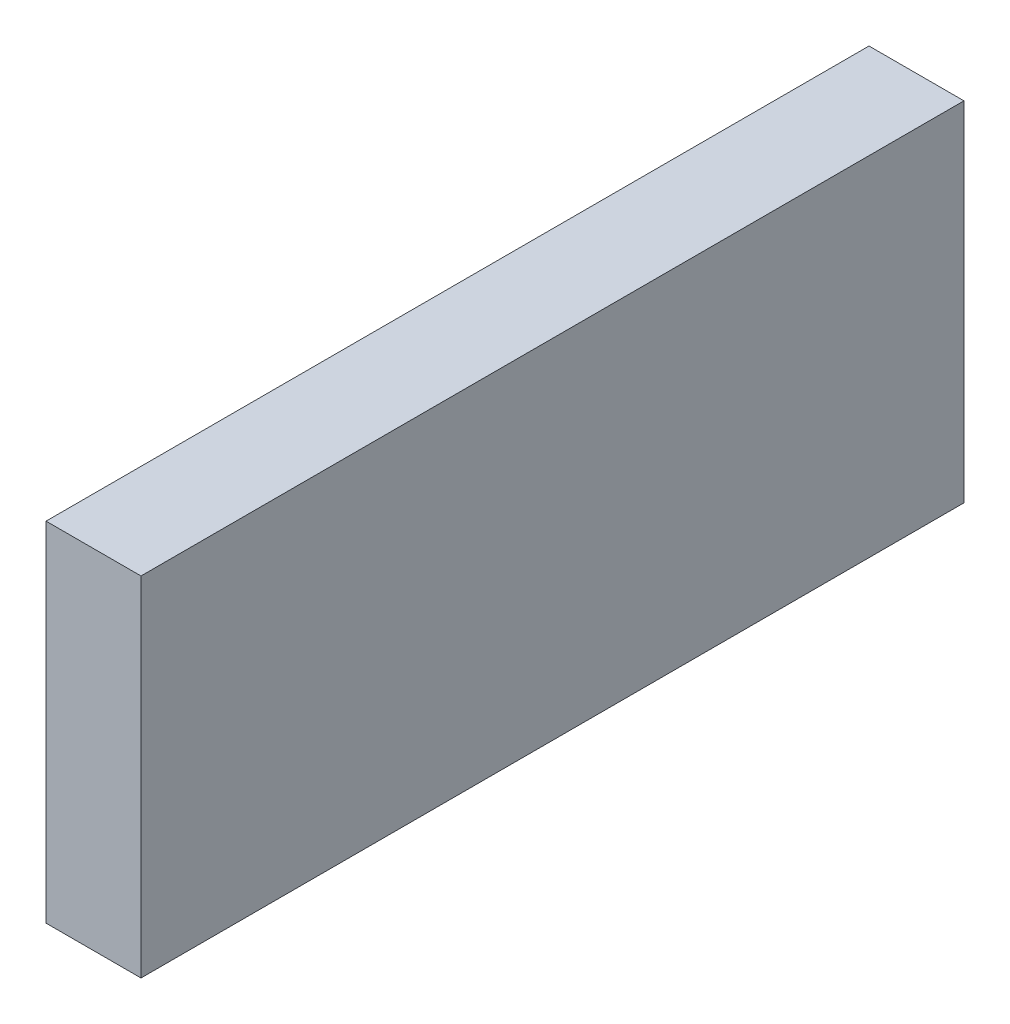
ISO-10303-21;
HEADER;
FILE_DESCRIPTION(('STEP AP214'),'2;1');
FILE_NAME('part.step','',(''),(''),'','','');
FILE_SCHEMA(('AUTOMOTIVE_DESIGN { 1 0 10303 214 1 1 1 1 }'));
ENDSEC;
DATA;
#1=APPLICATION_CONTEXT('core data for automotive mechanical design processes');
#2=APPLICATION_PROTOCOL_DEFINITION('international standard','automotive_design',2000,#1);
#3=PRODUCT_CONTEXT('',#1,'mechanical');
#4=PRODUCT('Part','Part','',(#3));
#5=PRODUCT_RELATED_PRODUCT_CATEGORY('part','',(#4));
#6=PRODUCT_DEFINITION_FORMATION('','',#4);
#7=PRODUCT_DEFINITION_CONTEXT('part definition',#1,'design');
#8=PRODUCT_DEFINITION('design','',#6,#7);
#9=PRODUCT_DEFINITION_SHAPE('','',#8);
#10=(LENGTH_UNIT() NAMED_UNIT(*) SI_UNIT(.MILLI.,.METRE.));
#11=(NAMED_UNIT(*) PLANE_ANGLE_UNIT() SI_UNIT($,.RADIAN.));
#12=(NAMED_UNIT(*) SI_UNIT($,.STERADIAN.) SOLID_ANGLE_UNIT());
#13=UNCERTAINTY_MEASURE_WITH_UNIT(LENGTH_MEASURE(1.E-05),#10,'distance_accuracy_value','');
#14=(GEOMETRIC_REPRESENTATION_CONTEXT(3) GLOBAL_UNCERTAINTY_ASSIGNED_CONTEXT((#13)) GLOBAL_UNIT_ASSIGNED_CONTEXT((#10,
#11,#12)) REPRESENTATION_CONTEXT('',''));
#15=CARTESIAN_POINT('',(0.,0.,0.));
#16=DIRECTION('',(0.,0.,1.));
#17=DIRECTION('',(1.,0.,0.));
#18=AXIS2_PLACEMENT_3D('',#15,#16,#17);
#19=CARTESIAN_POINT('',(-15.,110.,-130.));
#20=DIRECTION('',(1.,0.,0.));
#21=DIRECTION('',(0.,0.,-1.));
#22=AXIS2_PLACEMENT_3D('',#19,#20,#21);
#23=PLANE('',#22);
#24=DIRECTION('',(0.,0.,1.));
#25=VECTOR('',#24,1.);
#26=CARTESIAN_POINT('',(-15.,0.,-130.));
#27=LINE('',#26,#25);
#28=CARTESIAN_POINT('',(-15.,0.,-130.));
#29=VERTEX_POINT('',#28);
#30=CARTESIAN_POINT('',(-15.,0.,130.));
#31=VERTEX_POINT('',#30);
#32=EDGE_CURVE('E107',#29,#31,#27,.T.);
#33=ORIENTED_EDGE('',*,*,#32,.T.);
#34=DIRECTION('',(0.,-1.,0.));
#35=VECTOR('',#34,1.);
#36=CARTESIAN_POINT('',(-15.,110.,130.));
#37=LINE('',#36,#35);
#38=CARTESIAN_POINT('',(-15.,110.,130.));
#39=VERTEX_POINT('',#38);
#40=EDGE_CURVE('E11',#39,#31,#37,.T.);
#41=ORIENTED_EDGE('',*,*,#40,.F.);
#42=DIRECTION('',(0.,0.,1.));
#43=VECTOR('',#42,1.);
#44=CARTESIAN_POINT('',(-15.,110.,-130.));
#45=LINE('',#44,#43);
#46=CARTESIAN_POINT('',(-15.,110.,-130.));
#47=VERTEX_POINT('',#46);
#48=EDGE_CURVE('E91',#47,#39,#45,.T.);
#49=ORIENTED_EDGE('',*,*,#48,.F.);
#50=DIRECTION('',(0.,-1.,0.));
#51=VECTOR('',#50,1.);
#52=CARTESIAN_POINT('',(-15.,110.,-130.));
#53=LINE('',#52,#51);
#54=EDGE_CURVE('E103',#47,#29,#53,.T.);
#55=ORIENTED_EDGE('',*,*,#54,.T.);
#56=EDGE_LOOP('',(#33,#41,#49,#55));
#57=FACE_BOUND('',#56,.T.);
#58=ADVANCED_FACE('F39',(#57),#23,.F.);
#59=CARTESIAN_POINT('',(-15.,110.,130.));
#60=DIRECTION('',(0.,0.,-1.));
#61=DIRECTION('',(-1.,0.,0.));
#62=AXIS2_PLACEMENT_3D('',#59,#60,#61);
#63=PLANE('',#62);
#64=DIRECTION('',(1.,0.,0.));
#65=VECTOR('',#64,1.);
#66=CARTESIAN_POINT('',(-15.,0.,130.));
#67=LINE('',#66,#65);
#68=CARTESIAN_POINT('',(15.,0.,130.));
#69=VERTEX_POINT('',#68);
#70=EDGE_CURVE('E96',#31,#69,#67,.T.);
#71=ORIENTED_EDGE('',*,*,#70,.T.);
#72=DIRECTION('',(0.,-1.,0.));
#73=VECTOR('',#72,1.);
#74=CARTESIAN_POINT('',(15.,110.,130.));
#75=LINE('',#74,#73);
#76=CARTESIAN_POINT('',(15.,110.,130.));
#77=VERTEX_POINT('',#76);
#78=EDGE_CURVE('E48',#77,#69,#75,.T.);
#79=ORIENTED_EDGE('',*,*,#78,.F.);
#80=DIRECTION('',(1.,0.,0.));
#81=VECTOR('',#80,1.);
#82=CARTESIAN_POINT('',(-15.,110.,130.));
#83=LINE('',#82,#81);
#84=EDGE_CURVE('E86',#39,#77,#83,.T.);
#85=ORIENTED_EDGE('',*,*,#84,.F.);
#86=ORIENTED_EDGE('',*,*,#40,.T.);
#87=EDGE_LOOP('',(#71,#79,#85,#86));
#88=FACE_BOUND('',#87,.T.);
#89=ADVANCED_FACE('F95',(#88),#63,.F.);
#90=CARTESIAN_POINT('',(15.,110.,-130.));
#91=DIRECTION('',(-1.,0.,0.));
#92=DIRECTION('',(0.,0.,1.));
#93=AXIS2_PLACEMENT_3D('',#90,#91,#92);
#94=PLANE('',#93);
#95=DIRECTION('',(0.,0.,-1.));
#96=VECTOR('',#95,1.);
#97=CARTESIAN_POINT('',(15.,0.,-130.));
#98=LINE('',#97,#96);
#99=CARTESIAN_POINT('',(15.,0.,-130.));
#100=VERTEX_POINT('',#99);
#101=EDGE_CURVE('E73',#69,#100,#98,.T.);
#102=ORIENTED_EDGE('',*,*,#101,.T.);
#103=DIRECTION('',(0.,-1.,0.));
#104=VECTOR('',#103,1.);
#105=CARTESIAN_POINT('',(15.,110.,-130.));
#106=LINE('',#105,#104);
#107=CARTESIAN_POINT('',(15.,110.,-130.));
#108=VERTEX_POINT('',#107);
#109=EDGE_CURVE('E98',#108,#100,#106,.T.);
#110=ORIENTED_EDGE('',*,*,#109,.F.);
#111=DIRECTION('',(0.,0.,-1.));
#112=VECTOR('',#111,1.);
#113=CARTESIAN_POINT('',(15.,110.,-130.));
#114=LINE('',#113,#112);
#115=EDGE_CURVE('E89',#77,#108,#114,.T.);
#116=ORIENTED_EDGE('',*,*,#115,.F.);
#117=ORIENTED_EDGE('',*,*,#78,.T.);
#118=EDGE_LOOP('',(#102,#110,#116,#117));
#119=FACE_BOUND('',#118,.T.);
#120=ADVANCED_FACE('F99',(#119),#94,.F.);
#121=CARTESIAN_POINT('',(-15.,110.,-130.));
#122=DIRECTION('',(0.,0.,1.));
#123=DIRECTION('',(1.,0.,0.));
#124=AXIS2_PLACEMENT_3D('',#121,#122,#123);
#125=PLANE('',#124);
#126=DIRECTION('',(-1.,0.,0.));
#127=VECTOR('',#126,1.);
#128=CARTESIAN_POINT('',(-15.,0.,-130.));
#129=LINE('',#128,#127);
#130=EDGE_CURVE('E79',#100,#29,#129,.T.);
#131=ORIENTED_EDGE('',*,*,#130,.T.);
#132=ORIENTED_EDGE('',*,*,#54,.F.);
#133=DIRECTION('',(-1.,0.,0.));
#134=VECTOR('',#133,1.);
#135=CARTESIAN_POINT('',(-15.,110.,-130.));
#136=LINE('',#135,#134);
#137=EDGE_CURVE('E56',#108,#47,#136,.T.);
#138=ORIENTED_EDGE('',*,*,#137,.F.);
#139=ORIENTED_EDGE('',*,*,#109,.T.);
#140=EDGE_LOOP('',(#131,#132,#138,#139));
#141=FACE_BOUND('',#140,.T.);
#142=ADVANCED_FACE('F120',(#141),#125,.F.);
#143=CARTESIAN_POINT('',(0.,110.,0.));
#144=DIRECTION('',(0.,1.,0.));
#145=DIRECTION('',(0.,0.,1.));
#146=AXIS2_PLACEMENT_3D('',#143,#144,#145);
#147=PLANE('',#146);
#148=ORIENTED_EDGE('',*,*,#48,.T.);
#149=ORIENTED_EDGE('',*,*,#84,.T.);
#150=ORIENTED_EDGE('',*,*,#115,.T.);
#151=ORIENTED_EDGE('',*,*,#137,.T.);
#152=EDGE_LOOP('',(#148,#149,#150,#151));
#153=FACE_BOUND('',#152,.T.);
#154=ADVANCED_FACE('F87',(#153),#147,.T.);
#155=CARTESIAN_POINT('',(0.,0.,0.));
#156=DIRECTION('',(0.,1.,0.));
#157=DIRECTION('',(0.,0.,1.));
#158=AXIS2_PLACEMENT_3D('',#155,#156,#157);
#159=PLANE('',#158);
#160=ORIENTED_EDGE('',*,*,#32,.F.);
#161=ORIENTED_EDGE('',*,*,#130,.F.);
#162=ORIENTED_EDGE('',*,*,#101,.F.);
#163=ORIENTED_EDGE('',*,*,#70,.F.);
#164=EDGE_LOOP('',(#160,#161,#162,#163));
#165=FACE_BOUND('',#164,.T.);
#166=ADVANCED_FACE('F123',(#165),#159,.F.);
#167=CLOSED_SHELL('',(#58,#89,#120,#142,#154,#166));
#168=MANIFOLD_SOLID_BREP('B2',#167);
#169=ADVANCED_BREP_SHAPE_REPRESENTATION('',(#18,#168),#14);
#170=SHAPE_DEFINITION_REPRESENTATION(#9,#169);
ENDSEC;
END-ISO-10303-21;
